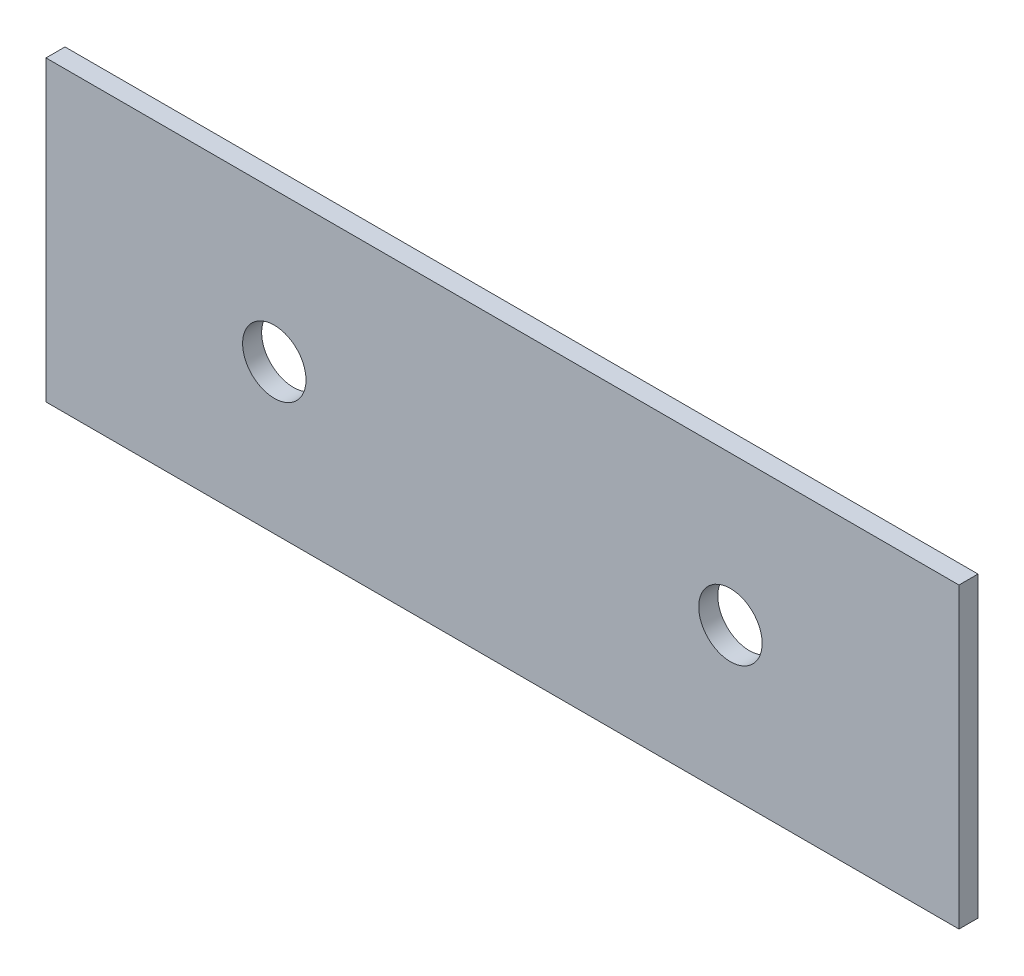
ISO-10303-21;
HEADER;
FILE_DESCRIPTION(('STEP AP214'),'2;1');
FILE_NAME('part.step','',(''),(''),'','','');
FILE_SCHEMA(('AUTOMOTIVE_DESIGN { 1 0 10303 214 1 1 1 1 }'));
ENDSEC;
DATA;
#1=APPLICATION_CONTEXT('core data for automotive mechanical design processes');
#2=APPLICATION_PROTOCOL_DEFINITION('international standard','automotive_design',2000,#1);
#3=PRODUCT_CONTEXT('',#1,'mechanical');
#4=PRODUCT('Part','Part','',(#3));
#5=PRODUCT_RELATED_PRODUCT_CATEGORY('part','',(#4));
#6=PRODUCT_DEFINITION_FORMATION('','',#4);
#7=PRODUCT_DEFINITION_CONTEXT('part definition',#1,'design');
#8=PRODUCT_DEFINITION('design','',#6,#7);
#9=PRODUCT_DEFINITION_SHAPE('','',#8);
#10=(LENGTH_UNIT() NAMED_UNIT(*) SI_UNIT(.MILLI.,.METRE.));
#11=(NAMED_UNIT(*) PLANE_ANGLE_UNIT() SI_UNIT($,.RADIAN.));
#12=(NAMED_UNIT(*) SI_UNIT($,.STERADIAN.) SOLID_ANGLE_UNIT());
#13=UNCERTAINTY_MEASURE_WITH_UNIT(LENGTH_MEASURE(1.E-05),#10,'distance_accuracy_value','');
#14=(GEOMETRIC_REPRESENTATION_CONTEXT(3) GLOBAL_UNCERTAINTY_ASSIGNED_CONTEXT((#13)) GLOBAL_UNIT_ASSIGNED_CONTEXT((#10,
#11,#12)) REPRESENTATION_CONTEXT('',''));
#15=CARTESIAN_POINT('',(0.,0.,0.));
#16=DIRECTION('',(0.,0.,1.));
#17=DIRECTION('',(1.,0.,0.));
#18=AXIS2_PLACEMENT_3D('',#15,#16,#17);
#19=CARTESIAN_POINT('',(159.64431366117,196.181377025538,3.));
#20=DIRECTION('',(0.,-1.,0.));
#21=DIRECTION('',(1.,0.,0.));
#22=AXIS2_PLACEMENT_3D('',#19,#20,#21);
#23=PLANE('',#22);
#24=DIRECTION('',(-1.,0.,0.));
#25=VECTOR('',#24,1.);
#26=CARTESIAN_POINT('',(159.64431366117,196.181377025538,0.));
#27=LINE('',#26,#25);
#28=CARTESIAN_POINT('',(159.64431366117,196.181377025538,0.));
#29=VERTEX_POINT('',#28);
#30=CARTESIAN_POINT('',(15.6443136611697,196.181377025538,0.));
#31=VERTEX_POINT('',#30);
#32=EDGE_CURVE('E99',#29,#31,#27,.T.);
#33=ORIENTED_EDGE('',*,*,#32,.F.);
#34=DIRECTION('',(0.,0.,-1.));
#35=VECTOR('',#34,1.);
#36=CARTESIAN_POINT('',(159.64431366117,196.181377025538,3.));
#37=LINE('',#36,#35);
#38=CARTESIAN_POINT('',(159.64431366117,196.181377025538,3.));
#39=VERTEX_POINT('',#38);
#40=EDGE_CURVE('E11',#39,#29,#37,.T.);
#41=ORIENTED_EDGE('',*,*,#40,.F.);
#42=DIRECTION('',(-1.,0.,0.));
#43=VECTOR('',#42,1.);
#44=CARTESIAN_POINT('',(159.64431366117,196.181377025538,3.));
#45=LINE('',#44,#43);
#46=CARTESIAN_POINT('',(15.6443136611697,196.181377025538,3.));
#47=VERTEX_POINT('',#46);
#48=EDGE_CURVE('E92',#39,#47,#45,.T.);
#49=ORIENTED_EDGE('',*,*,#48,.T.);
#50=DIRECTION('',(0.,0.,-1.));
#51=VECTOR('',#50,1.);
#52=CARTESIAN_POINT('',(15.6443136611697,196.181377025538,3.));
#53=LINE('',#52,#51);
#54=EDGE_CURVE('E75',#47,#31,#53,.T.);
#55=ORIENTED_EDGE('',*,*,#54,.T.);
#56=EDGE_LOOP('',(#33,#41,#49,#55));
#57=FACE_BOUND('',#56,.T.);
#58=ADVANCED_FACE('F32',(#57),#23,.T.);
#59=CARTESIAN_POINT('',(159.64431366117,243.181377025538,3.));
#60=DIRECTION('',(1.,0.,0.));
#61=DIRECTION('',(0.,0.,-1.));
#62=AXIS2_PLACEMENT_3D('',#59,#60,#61);
#63=PLANE('',#62);
#64=DIRECTION('',(0.,-1.,0.));
#65=VECTOR('',#64,1.);
#66=CARTESIAN_POINT('',(159.64431366117,243.181377025538,0.));
#67=LINE('',#66,#65);
#68=CARTESIAN_POINT('',(159.64431366117,243.181377025538,0.));
#69=VERTEX_POINT('',#68);
#70=EDGE_CURVE('E94',#69,#29,#67,.T.);
#71=ORIENTED_EDGE('',*,*,#70,.F.);
#72=DIRECTION('',(0.,0.,-1.));
#73=VECTOR('',#72,1.);
#74=CARTESIAN_POINT('',(159.64431366117,243.181377025538,3.));
#75=LINE('',#74,#73);
#76=CARTESIAN_POINT('',(159.64431366117,243.181377025538,3.));
#77=VERTEX_POINT('',#76);
#78=EDGE_CURVE('E41',#77,#69,#75,.T.);
#79=ORIENTED_EDGE('',*,*,#78,.F.);
#80=DIRECTION('',(0.,-1.,0.));
#81=VECTOR('',#80,1.);
#82=CARTESIAN_POINT('',(159.64431366117,243.181377025538,3.));
#83=LINE('',#82,#81);
#84=EDGE_CURVE('E89',#77,#39,#83,.T.);
#85=ORIENTED_EDGE('',*,*,#84,.T.);
#86=ORIENTED_EDGE('',*,*,#40,.T.);
#87=EDGE_LOOP('',(#71,#79,#85,#86));
#88=FACE_BOUND('',#87,.T.);
#89=ADVANCED_FACE('F136',(#88),#63,.T.);
#90=CARTESIAN_POINT('',(15.6443136611697,243.181377025538,3.));
#91=DIRECTION('',(0.,1.,0.));
#92=DIRECTION('',(0.,0.,1.));
#93=AXIS2_PLACEMENT_3D('',#90,#91,#92);
#94=PLANE('',#93);
#95=DIRECTION('',(1.,0.,0.));
#96=VECTOR('',#95,1.);
#97=CARTESIAN_POINT('',(15.6443136611697,243.181377025538,0.));
#98=LINE('',#97,#96);
#99=CARTESIAN_POINT('',(15.6443136611697,243.181377025538,0.));
#100=VERTEX_POINT('',#99);
#101=EDGE_CURVE('E83',#100,#69,#98,.T.);
#102=ORIENTED_EDGE('',*,*,#101,.F.);
#103=DIRECTION('',(0.,0.,-1.));
#104=VECTOR('',#103,1.);
#105=CARTESIAN_POINT('',(15.6443136611697,243.181377025538,3.));
#106=LINE('',#105,#104);
#107=CARTESIAN_POINT('',(15.6443136611697,243.181377025538,3.));
#108=VERTEX_POINT('',#107);
#109=EDGE_CURVE('E78',#108,#100,#106,.T.);
#110=ORIENTED_EDGE('',*,*,#109,.F.);
#111=DIRECTION('',(1.,0.,0.));
#112=VECTOR('',#111,1.);
#113=CARTESIAN_POINT('',(15.6443136611697,243.181377025538,3.));
#114=LINE('',#113,#112);
#115=EDGE_CURVE('E81',#108,#77,#114,.T.);
#116=ORIENTED_EDGE('',*,*,#115,.T.);
#117=ORIENTED_EDGE('',*,*,#78,.T.);
#118=EDGE_LOOP('',(#102,#110,#116,#117));
#119=FACE_BOUND('',#118,.T.);
#120=ADVANCED_FACE('F80',(#119),#94,.T.);
#121=CARTESIAN_POINT('',(15.6443136611697,196.181377025538,3.));
#122=DIRECTION('',(-1.,0.,0.));
#123=DIRECTION('',(0.,0.,1.));
#124=AXIS2_PLACEMENT_3D('',#121,#122,#123);
#125=PLANE('',#124);
#126=DIRECTION('',(0.,1.,0.));
#127=VECTOR('',#126,1.);
#128=CARTESIAN_POINT('',(15.6443136611697,196.181377025538,0.));
#129=LINE('',#128,#127);
#130=EDGE_CURVE('E102',#31,#100,#129,.T.);
#131=ORIENTED_EDGE('',*,*,#130,.F.);
#132=ORIENTED_EDGE('',*,*,#54,.F.);
#133=DIRECTION('',(0.,1.,0.));
#134=VECTOR('',#133,1.);
#135=CARTESIAN_POINT('',(15.6443136611697,196.181377025538,3.));
#136=LINE('',#135,#134);
#137=EDGE_CURVE('E88',#47,#108,#136,.T.);
#138=ORIENTED_EDGE('',*,*,#137,.T.);
#139=ORIENTED_EDGE('',*,*,#109,.T.);
#140=EDGE_LOOP('',(#131,#132,#138,#139));
#141=FACE_BOUND('',#140,.T.);
#142=ADVANCED_FACE('F91',(#141),#125,.T.);
#143=CARTESIAN_POINT('',(0.,0.,3.));
#144=DIRECTION('',(0.,0.,-1.));
#145=DIRECTION('',(-1.,0.,0.));
#146=AXIS2_PLACEMENT_3D('',#143,#144,#145);
#147=PLANE('',#146);
#148=CARTESIAN_POINT('',(51.6525825952789,219.681377025538,3.));
#149=DIRECTION('',(0.,0.,1.));
#150=DIRECTION('',(1.,0.,0.));
#151=AXIS2_PLACEMENT_3D('',#148,#149,#150);
#152=CIRCLE('',#151,5.);
#153=CARTESIAN_POINT('',(56.6525825952789,219.681377025538,3.));
#154=VERTEX_POINT('',#153);
#155=EDGE_CURVE('E110',#154,#154,#152,.T.);
#156=ORIENTED_EDGE('',*,*,#155,.F.);
#157=EDGE_LOOP('',(#156));
#158=FACE_BOUND('',#157,.T.);
#159=CARTESIAN_POINT('',(123.597865767679,219.681377025538,3.));
#160=DIRECTION('',(0.,0.,1.));
#161=DIRECTION('',(1.,0.,0.));
#162=AXIS2_PLACEMENT_3D('',#159,#160,#161);
#163=CIRCLE('',#162,4.99999999999999);
#164=CARTESIAN_POINT('',(128.597865767679,219.681377025538,3.));
#165=VERTEX_POINT('',#164);
#166=EDGE_CURVE('E115',#165,#165,#163,.T.);
#167=ORIENTED_EDGE('',*,*,#166,.F.);
#168=EDGE_LOOP('',(#167));
#169=FACE_BOUND('',#168,.T.);
#170=ORIENTED_EDGE('',*,*,#48,.F.);
#171=ORIENTED_EDGE('',*,*,#84,.F.);
#172=ORIENTED_EDGE('',*,*,#115,.F.);
#173=ORIENTED_EDGE('',*,*,#137,.F.);
#174=EDGE_LOOP('',(#170,#171,#172,#173));
#175=FACE_BOUND('',#174,.T.);
#176=ADVANCED_FACE('F87',(#158,#169,#175),#147,.F.);
#177=CARTESIAN_POINT('',(0.,0.,0.));
#178=DIRECTION('',(0.,0.,-1.));
#179=DIRECTION('',(-1.,0.,0.));
#180=AXIS2_PLACEMENT_3D('',#177,#178,#179);
#181=PLANE('',#180);
#182=CARTESIAN_POINT('',(51.6525825952789,219.681377025538,0.));
#183=DIRECTION('',(0.,0.,-1.));
#184=DIRECTION('',(-1.,0.,0.));
#185=AXIS2_PLACEMENT_3D('',#182,#183,#184);
#186=CIRCLE('',#185,5.);
#187=CARTESIAN_POINT('',(46.6525825952789,219.681377025538,0.));
#188=VERTEX_POINT('',#187);
#189=EDGE_CURVE('E35',#188,#188,#186,.T.);
#190=ORIENTED_EDGE('',*,*,#189,.F.);
#191=EDGE_LOOP('',(#190));
#192=FACE_BOUND('',#191,.T.);
#193=CARTESIAN_POINT('',(123.597865767679,219.681377025538,0.));
#194=DIRECTION('',(0.,0.,-1.));
#195=DIRECTION('',(-1.,0.,0.));
#196=AXIS2_PLACEMENT_3D('',#193,#194,#195);
#197=CIRCLE('',#196,4.99999999999999);
#198=CARTESIAN_POINT('',(118.597865767679,219.681377025538,0.));
#199=VERTEX_POINT('',#198);
#200=EDGE_CURVE('E108',#199,#199,#197,.T.);
#201=ORIENTED_EDGE('',*,*,#200,.F.);
#202=EDGE_LOOP('',(#201));
#203=FACE_BOUND('',#202,.T.);
#204=ORIENTED_EDGE('',*,*,#32,.T.);
#205=ORIENTED_EDGE('',*,*,#130,.T.);
#206=ORIENTED_EDGE('',*,*,#101,.T.);
#207=ORIENTED_EDGE('',*,*,#70,.T.);
#208=EDGE_LOOP('',(#204,#205,#206,#207));
#209=FACE_BOUND('',#208,.T.);
#210=ADVANCED_FACE('F125',(#192,#203,#209),#181,.T.);
#211=CARTESIAN_POINT('',(123.597865767679,219.681377025538,-7.));
#212=DIRECTION('',(0.,0.,1.));
#213=DIRECTION('',(1.,0.,0.));
#214=AXIS2_PLACEMENT_3D('',#211,#212,#213);
#215=CYLINDRICAL_SURFACE('',#214,4.99999999999999);
#216=ORIENTED_EDGE('',*,*,#200,.T.);
#217=EDGE_LOOP('',(#216));
#218=FACE_BOUND('',#217,.T.);
#219=ORIENTED_EDGE('',*,*,#166,.T.);
#220=EDGE_LOOP('',(#219));
#221=FACE_BOUND('',#220,.T.);
#222=ADVANCED_FACE('F122',(#218,#221),#215,.F.);
#223=CARTESIAN_POINT('',(51.6525825952789,219.681377025538,-7.));
#224=DIRECTION('',(0.,0.,1.));
#225=DIRECTION('',(1.,0.,0.));
#226=AXIS2_PLACEMENT_3D('',#223,#224,#225);
#227=CYLINDRICAL_SURFACE('',#226,5.);
#228=ORIENTED_EDGE('',*,*,#189,.T.);
#229=EDGE_LOOP('',(#228));
#230=FACE_BOUND('',#229,.T.);
#231=ORIENTED_EDGE('',*,*,#155,.T.);
#232=EDGE_LOOP('',(#231));
#233=FACE_BOUND('',#232,.T.);
#234=ADVANCED_FACE('F171',(#230,#233),#227,.F.);
#235=CLOSED_SHELL('',(#58,#89,#120,#142,#176,#210,#222,#234));
#236=MANIFOLD_SOLID_BREP('B2',#235);
#237=ADVANCED_BREP_SHAPE_REPRESENTATION('',(#18,#236),#14);
#238=SHAPE_DEFINITION_REPRESENTATION(#9,#237);
ENDSEC;
END-ISO-10303-21;
